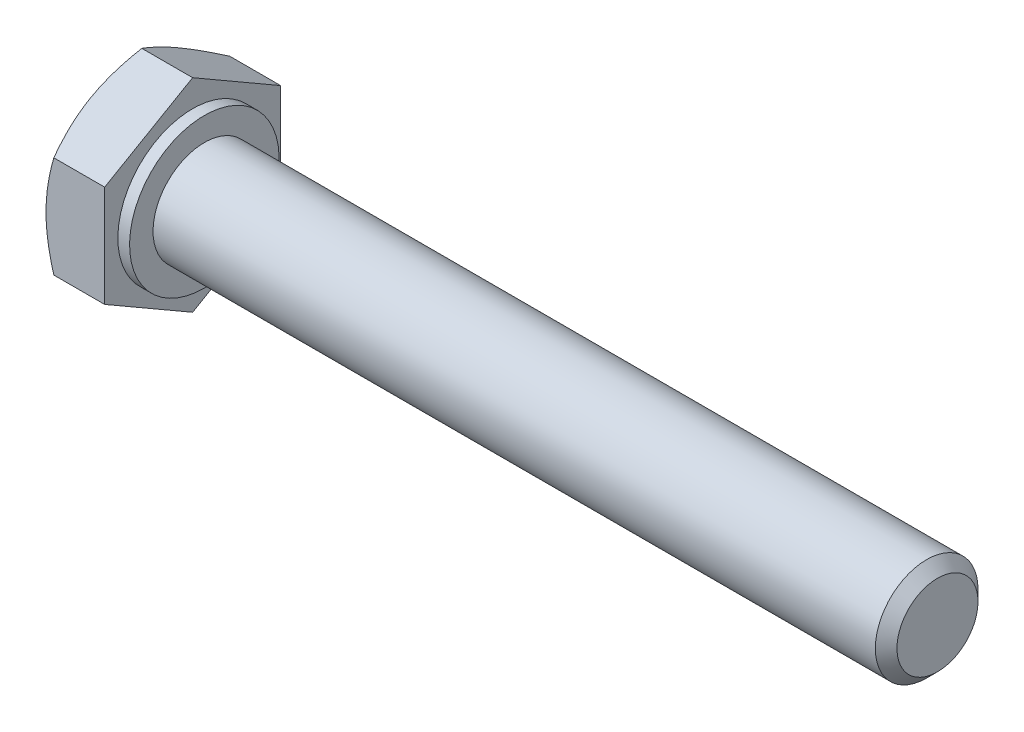
ISO-10303-21;
HEADER;
FILE_DESCRIPTION(('STEP AP214'),'2;1');
FILE_NAME('part.step','',(''),(''),'','','');
FILE_SCHEMA(('AUTOMOTIVE_DESIGN { 1 0 10303 214 1 1 1 1 }'));
ENDSEC;
DATA;
#1=APPLICATION_CONTEXT('core data for automotive mechanical design processes');
#2=APPLICATION_PROTOCOL_DEFINITION('international standard','automotive_design',2000,#1);
#3=PRODUCT_CONTEXT('',#1,'mechanical');
#4=PRODUCT('Part','Part','',(#3));
#5=PRODUCT_RELATED_PRODUCT_CATEGORY('part','',(#4));
#6=PRODUCT_DEFINITION_FORMATION('','',#4);
#7=PRODUCT_DEFINITION_CONTEXT('part definition',#1,'design');
#8=PRODUCT_DEFINITION('design','',#6,#7);
#9=PRODUCT_DEFINITION_SHAPE('','',#8);
#10=(LENGTH_UNIT() NAMED_UNIT(*) SI_UNIT(.MILLI.,.METRE.));
#11=(NAMED_UNIT(*) PLANE_ANGLE_UNIT() SI_UNIT($,.RADIAN.));
#12=(NAMED_UNIT(*) SI_UNIT($,.STERADIAN.) SOLID_ANGLE_UNIT());
#13=UNCERTAINTY_MEASURE_WITH_UNIT(LENGTH_MEASURE(1.E-05),#10,'distance_accuracy_value','');
#14=(GEOMETRIC_REPRESENTATION_CONTEXT(3) GLOBAL_UNCERTAINTY_ASSIGNED_CONTEXT((#13)) GLOBAL_UNIT_ASSIGNED_CONTEXT((#10,
#11,#12)) REPRESENTATION_CONTEXT('',''));
#15=CARTESIAN_POINT('',(0.,0.,0.));
#16=DIRECTION('',(0.,0.,1.));
#17=DIRECTION('',(1.,0.,0.));
#18=AXIS2_PLACEMENT_3D('',#15,#16,#17);
#19=CARTESIAN_POINT('',(0.,2.15,0.));
#20=DIRECTION('',(1.,0.,0.));
#21=DIRECTION('',(0.,1.,0.));
#22=AXIS2_PLACEMENT_3D('',#19,#20,#21);
#23=PLANE('',#22);
#24=CARTESIAN_POINT('',(0.,0.,0.));
#25=DIRECTION('',(1.,0.,0.));
#26=DIRECTION('',(0.,1.,0.));
#27=AXIS2_PLACEMENT_3D('',#24,#25,#26);
#28=CIRCLE('',#27,1.75);
#29=CARTESIAN_POINT('',(0.,-1.75,0.));
#30=VERTEX_POINT('',#29);
#31=EDGE_CURVE('E279',#30,#30,#28,.T.);
#32=ORIENTED_EDGE('',*,*,#31,.F.);
#33=EDGE_LOOP('',(#32));
#34=FACE_BOUND('',#33,.T.);
#35=CARTESIAN_POINT('',(0.,0.,0.));
#36=DIRECTION('',(1.,0.,0.));
#37=DIRECTION('',(0.,1.,0.));
#38=AXIS2_PLACEMENT_3D('',#35,#36,#37);
#39=CIRCLE('',#38,2.55);
#40=CARTESIAN_POINT('',(0.,-2.55,0.));
#41=VERTEX_POINT('',#40);
#42=EDGE_CURVE('E27',#41,#41,#39,.T.);
#43=ORIENTED_EDGE('',*,*,#42,.T.);
#44=EDGE_LOOP('',(#43));
#45=FACE_BOUND('',#44,.T.);
#46=ADVANCED_FACE('F16',(#34,#45),#23,.T.);
#47=CARTESIAN_POINT('',(-0.200049999999994,0.,0.));
#48=DIRECTION('',(1.,0.,0.));
#49=DIRECTION('',(0.,1.,0.));
#50=AXIS2_PLACEMENT_3D('',#47,#48,#49);
#51=CYLINDRICAL_SURFACE('',#50,2.55);
#52=ORIENTED_EDGE('',*,*,#42,.F.);
#53=DIRECTION('',(-1.,0.,0.));
#54=VECTOR('',#53,1.);
#55=CARTESIAN_POINT('',(-0.200049999999994,-2.55,0.));
#56=LINE('',#55,#54);
#57=CARTESIAN_POINT('',(-0.400099999999992,-2.55,0.));
#58=VERTEX_POINT('',#57);
#59=EDGE_CURVE('E11',#41,#58,#56,.T.);
#60=ORIENTED_EDGE('',*,*,#59,.T.);
#61=CARTESIAN_POINT('',(-0.400099999999992,0.,0.));
#62=DIRECTION('',(1.,0.,0.));
#63=DIRECTION('',(0.,1.,0.));
#64=AXIS2_PLACEMENT_3D('',#61,#62,#63);
#65=CIRCLE('',#64,2.55);
#66=EDGE_CURVE('E269',#58,#58,#65,.T.);
#67=ORIENTED_EDGE('',*,*,#66,.T.);
#68=ORIENTED_EDGE('',*,*,#59,.F.);
#69=EDGE_LOOP('',(#52,#60,#67,#68));
#70=FACE_BOUND('',#69,.T.);
#71=ADVANCED_FACE('F426',(#70),#51,.T.);
#72=CARTESIAN_POINT('',(-2.4001,0.,0.));
#73=DIRECTION('',(1.,0.,0.));
#74=DIRECTION('',(0.,1.,0.));
#75=AXIS2_PLACEMENT_3D('',#72,#73,#74);
#76=PLANE('',#75);
#77=CARTESIAN_POINT('',(-2.4001,0.,0.));
#78=DIRECTION('',(-1.,0.,0.));
#79=DIRECTION('',(0.,1.,0.));
#80=AXIS2_PLACEMENT_3D('',#77,#78,#79);
#81=CIRCLE('',#80,3.);
#82=CARTESIAN_POINT('',(-2.4001,0.,3.));
#83=VERTEX_POINT('',#82);
#84=CARTESIAN_POINT('',(-2.4001,2.59807621135331,1.5));
#85=VERTEX_POINT('',#84);
#86=EDGE_CURVE('E173',#83,#85,#81,.T.);
#87=ORIENTED_EDGE('',*,*,#86,.T.);
#88=CARTESIAN_POINT('',(-2.4001,0.,0.));
#89=DIRECTION('',(-1.,0.,0.));
#90=DIRECTION('',(0.,1.,0.));
#91=AXIS2_PLACEMENT_3D('',#88,#89,#90);
#92=CIRCLE('',#91,3.);
#93=CARTESIAN_POINT('',(-2.4001,2.59807621135331,-1.5));
#94=VERTEX_POINT('',#93);
#95=EDGE_CURVE('E180',#85,#94,#92,.T.);
#96=ORIENTED_EDGE('',*,*,#95,.T.);
#97=CARTESIAN_POINT('',(-2.4001,0.,0.));
#98=DIRECTION('',(-1.,0.,0.));
#99=DIRECTION('',(0.,1.,0.));
#100=AXIS2_PLACEMENT_3D('',#97,#98,#99);
#101=CIRCLE('',#100,3.);
#102=CARTESIAN_POINT('',(-2.4001,0.,-3.));
#103=VERTEX_POINT('',#102);
#104=EDGE_CURVE('E237',#94,#103,#101,.T.);
#105=ORIENTED_EDGE('',*,*,#104,.T.);
#106=CARTESIAN_POINT('',(-2.4001,0.,0.));
#107=DIRECTION('',(-1.,0.,0.));
#108=DIRECTION('',(0.,1.,0.));
#109=AXIS2_PLACEMENT_3D('',#106,#107,#108);
#110=CIRCLE('',#109,3.);
#111=CARTESIAN_POINT('',(-2.4001,-2.59807621135331,-1.5));
#112=VERTEX_POINT('',#111);
#113=EDGE_CURVE('E135',#103,#112,#110,.T.);
#114=ORIENTED_EDGE('',*,*,#113,.T.);
#115=CARTESIAN_POINT('',(-2.4001,0.,0.));
#116=DIRECTION('',(-1.,0.,0.));
#117=DIRECTION('',(0.,1.,0.));
#118=AXIS2_PLACEMENT_3D('',#115,#116,#117);
#119=CIRCLE('',#118,3.);
#120=CARTESIAN_POINT('',(-2.4001,-2.59807621135331,1.5));
#121=VERTEX_POINT('',#120);
#122=EDGE_CURVE('E127',#112,#121,#119,.T.);
#123=ORIENTED_EDGE('',*,*,#122,.T.);
#124=CARTESIAN_POINT('',(-2.4001,0.,0.));
#125=DIRECTION('',(-1.,0.,0.));
#126=DIRECTION('',(0.,1.,0.));
#127=AXIS2_PLACEMENT_3D('',#124,#125,#126);
#128=CIRCLE('',#127,3.);
#129=EDGE_CURVE('E132',#121,#83,#128,.T.);
#130=ORIENTED_EDGE('',*,*,#129,.T.);
#131=EDGE_LOOP('',(#87,#96,#105,#114,#123,#130));
#132=FACE_BOUND('',#131,.T.);
#133=ADVANCED_FACE('F130',(#132),#76,.F.);
#134=CARTESIAN_POINT('',(-0.400099999999993,-3.46410161513775,0.));
#135=DIRECTION('',(0.,-0.866025403784438,-0.5));
#136=DIRECTION('',(0.,0.5,-0.866025403784439));
#137=AXIS2_PLACEMENT_3D('',#134,#135,#136);
#138=PLANE('',#137);
#139=CARTESIAN_POINT('',(-2.4001,-2.59807621135331,-1.5));
#140=CARTESIAN_POINT('',(-2.40010000000001,-2.19615242270664,-2.19615242270662));
#141=CARTESIAN_POINT('',(-2.1321508075689,-1.73205080756889,-3.));
#142=(BOUNDED_CURVE() B_SPLINE_CURVE(2,(#139,#140,#141),.UNSPECIFIED.,.F.,
.F.) B_SPLINE_CURVE_WITH_KNOTS((3,3),(0.17571291563257,0.35142583126514),
.UNSPECIFIED.) CURVE() GEOMETRIC_REPRESENTATION_ITEM() RATIONAL_B_SPLINE_CURVE((1.,
1.03795484930203,1.)) REPRESENTATION_ITEM(''));
#143=CARTESIAN_POINT('',(-2.1321508075689,-1.73205080756889,-3.));
#144=VERTEX_POINT('',#143);
#145=EDGE_CURVE('E203',#112,#144,#142,.T.);
#146=ORIENTED_EDGE('',*,*,#145,.T.);
#147=DIRECTION('',(-1.,0.,0.));
#148=VECTOR('',#147,1.);
#149=CARTESIAN_POINT('',(-0.400099999999993,-1.73205080756887,-3.));
#150=LINE('',#149,#148);
#151=CARTESIAN_POINT('',(-0.400099999999993,-1.73205080756887,-3.));
#152=VERTEX_POINT('',#151);
#153=EDGE_CURVE('E263',#152,#144,#150,.T.);
#154=ORIENTED_EDGE('',*,*,#153,.F.);
#155=DIRECTION('',(0.,0.5,-0.866025403784438));
#156=VECTOR('',#155,1.);
#157=CARTESIAN_POINT('',(-0.400099999999993,-3.46410161513775,0.));
#158=LINE('',#157,#156);
#159=CARTESIAN_POINT('',(-0.400099999999993,-3.46410161513775,0.));
#160=VERTEX_POINT('',#159);
#161=EDGE_CURVE('E20',#160,#152,#158,.T.);
#162=ORIENTED_EDGE('',*,*,#161,.F.);
#163=DIRECTION('',(-1.,0.,0.));
#164=VECTOR('',#163,1.);
#165=CARTESIAN_POINT('',(-0.400099999999993,-3.46410161513775,0.));
#166=LINE('',#165,#164);
#167=CARTESIAN_POINT('',(-2.1321508075689,-3.46410161513774,0.));
#168=VERTEX_POINT('',#167);
#169=EDGE_CURVE('E268',#160,#168,#166,.T.);
#170=ORIENTED_EDGE('',*,*,#169,.T.);
#171=CARTESIAN_POINT('',(-2.1321508075689,-3.46410161513774,0.));
#172=CARTESIAN_POINT('',(-2.40010000000001,-2.99999999999999,-0.803847577293378));
#173=CARTESIAN_POINT('',(-2.4001,-2.59807621135331,-1.5));
#174=(BOUNDED_CURVE() B_SPLINE_CURVE(2,(#171,#172,#173),.UNSPECIFIED.,.F.,
.F.) B_SPLINE_CURVE_WITH_KNOTS((3,3),(0.,0.17571291563257),
.UNSPECIFIED.) CURVE() GEOMETRIC_REPRESENTATION_ITEM() RATIONAL_B_SPLINE_CURVE((1.,
1.03795484930203,1.)) REPRESENTATION_ITEM(''));
#175=EDGE_CURVE('E146',#168,#112,#174,.T.);
#176=ORIENTED_EDGE('',*,*,#175,.T.);
#177=EDGE_LOOP('',(#146,#154,#162,#170,#176));
#178=FACE_BOUND('',#177,.T.);
#179=ADVANCED_FACE('F345',(#178),#138,.T.);
#180=CARTESIAN_POINT('',(-0.400099999999993,-1.73205080756888,3.));
#181=DIRECTION('',(0.,-0.866025403784439,0.5));
#182=DIRECTION('',(-1.,0.,0.));
#183=AXIS2_PLACEMENT_3D('',#180,#181,#182);
#184=PLANE('',#183);
#185=CARTESIAN_POINT('',(-2.4001,-2.59807621135331,1.5));
#186=CARTESIAN_POINT('',(-2.40010000000001,-2.99999999999999,0.803847577293377));
#187=CARTESIAN_POINT('',(-2.1321508075689,-3.46410161513774,0.));
#188=(BOUNDED_CURVE() B_SPLINE_CURVE(2,(#185,#186,#187),.UNSPECIFIED.,.F.,
.F.) B_SPLINE_CURVE_WITH_KNOTS((3,3),(0.17571291563257,0.35142583126514),
.UNSPECIFIED.) CURVE() GEOMETRIC_REPRESENTATION_ITEM() RATIONAL_B_SPLINE_CURVE((1.,
1.03795484930203,1.)) REPRESENTATION_ITEM(''));
#189=EDGE_CURVE('E142',#121,#168,#188,.T.);
#190=ORIENTED_EDGE('',*,*,#189,.T.);
#191=ORIENTED_EDGE('',*,*,#169,.F.);
#192=DIRECTION('',(0.,-0.5,-0.866025403784439));
#193=VECTOR('',#192,1.);
#194=CARTESIAN_POINT('',(-0.400099999999993,-1.73205080756888,3.));
#195=LINE('',#194,#193);
#196=CARTESIAN_POINT('',(-0.400099999999993,-1.73205080756888,3.));
#197=VERTEX_POINT('',#196);
#198=EDGE_CURVE('E197',#197,#160,#195,.T.);
#199=ORIENTED_EDGE('',*,*,#198,.F.);
#200=DIRECTION('',(-1.,0.,0.));
#201=VECTOR('',#200,1.);
#202=CARTESIAN_POINT('',(-0.400099999999993,-1.73205080756888,3.));
#203=LINE('',#202,#201);
#204=CARTESIAN_POINT('',(-2.1321508075689,-1.73205080756885,3.));
#205=VERTEX_POINT('',#204);
#206=EDGE_CURVE('E163',#197,#205,#203,.T.);
#207=ORIENTED_EDGE('',*,*,#206,.T.);
#208=CARTESIAN_POINT('',(-2.1321508075689,-1.73205080756889,3.));
#209=CARTESIAN_POINT('',(-2.40010000000001,-2.19615242270664,2.19615242270662));
#210=CARTESIAN_POINT('',(-2.4001,-2.59807621135331,1.5));
#211=(BOUNDED_CURVE() B_SPLINE_CURVE(2,(#208,#209,#210),.UNSPECIFIED.,.F.,
.F.) B_SPLINE_CURVE_WITH_KNOTS((3,3),(0.,0.17571291563257),
.UNSPECIFIED.) CURVE() GEOMETRIC_REPRESENTATION_ITEM() RATIONAL_B_SPLINE_CURVE((1.,
1.03795484930203,1.)) REPRESENTATION_ITEM(''));
#212=EDGE_CURVE('E154',#205,#121,#211,.T.);
#213=ORIENTED_EDGE('',*,*,#212,.T.);
#214=EDGE_LOOP('',(#190,#191,#199,#207,#213));
#215=FACE_BOUND('',#214,.T.);
#216=ADVANCED_FACE('F161',(#215),#184,.T.);
#217=CARTESIAN_POINT('',(-0.400099999999994,1.73205080756887,3.));
#218=DIRECTION('',(0.,0.,1.));
#219=DIRECTION('',(0.,-1.,0.));
#220=AXIS2_PLACEMENT_3D('',#217,#218,#219);
#221=PLANE('',#220);
#222=CARTESIAN_POINT('',(-2.4001,0.,3.));
#223=CARTESIAN_POINT('',(-2.40010000000001,-0.803847577293359,3.));
#224=CARTESIAN_POINT('',(-2.1321508075689,-1.73205080756885,3.));
#225=(BOUNDED_CURVE() B_SPLINE_CURVE(2,(#222,#223,#224),.UNSPECIFIED.,.F.,
.F.) B_SPLINE_CURVE_WITH_KNOTS((3,3),(0.17571291563257,0.35142583126514),
.UNSPECIFIED.) CURVE() GEOMETRIC_REPRESENTATION_ITEM() RATIONAL_B_SPLINE_CURVE((1.,
1.03795484930204,1.)) REPRESENTATION_ITEM(''));
#226=EDGE_CURVE('E156',#83,#205,#225,.T.);
#227=ORIENTED_EDGE('',*,*,#226,.T.);
#228=ORIENTED_EDGE('',*,*,#206,.F.);
#229=DIRECTION('',(0.,-1.,0.));
#230=VECTOR('',#229,1.);
#231=CARTESIAN_POINT('',(-0.400099999999994,1.73205080756887,3.));
#232=LINE('',#231,#230);
#233=CARTESIAN_POINT('',(-0.400099999999994,1.73205080756887,3.));
#234=VERTEX_POINT('',#233);
#235=EDGE_CURVE('E200',#234,#197,#232,.T.);
#236=ORIENTED_EDGE('',*,*,#235,.F.);
#237=DIRECTION('',(-1.,0.,0.));
#238=VECTOR('',#237,1.);
#239=CARTESIAN_POINT('',(-0.400099999999994,1.73205080756887,3.));
#240=LINE('',#239,#238);
#241=CARTESIAN_POINT('',(-2.1321508075689,1.73205080756884,3.));
#242=VERTEX_POINT('',#241);
#243=EDGE_CURVE('E227',#234,#242,#240,.T.);
#244=ORIENTED_EDGE('',*,*,#243,.T.);
#245=CARTESIAN_POINT('',(-2.1321508075689,1.73205080756884,3.));
#246=CARTESIAN_POINT('',(-2.40010000000001,0.803847577293353,3.));
#247=CARTESIAN_POINT('',(-2.4001,0.,3.));
#248=(BOUNDED_CURVE() B_SPLINE_CURVE(2,(#245,#246,#247),.UNSPECIFIED.,.F.,
.F.) B_SPLINE_CURVE_WITH_KNOTS((3,3),(0.,0.17571291563257),
.UNSPECIFIED.) CURVE() GEOMETRIC_REPRESENTATION_ITEM() RATIONAL_B_SPLINE_CURVE((1.,
1.03795484930205,1.)) REPRESENTATION_ITEM(''));
#249=EDGE_CURVE('E165',#242,#83,#248,.T.);
#250=ORIENTED_EDGE('',*,*,#249,.T.);
#251=EDGE_LOOP('',(#227,#228,#236,#244,#250));
#252=FACE_BOUND('',#251,.T.);
#253=ADVANCED_FACE('F366',(#252),#221,.T.);
#254=CARTESIAN_POINT('',(-0.400099999999993,0.,0.));
#255=DIRECTION('',(1.,0.,0.));
#256=DIRECTION('',(0.,1.,0.));
#257=AXIS2_PLACEMENT_3D('',#254,#255,#256);
#258=PLANE('',#257);
#259=ORIENTED_EDGE('',*,*,#66,.F.);
#260=EDGE_LOOP('',(#259));
#261=FACE_BOUND('',#260,.T.);
#262=DIRECTION('',(0.,-0.5,0.866025403784438));
#263=VECTOR('',#262,1.);
#264=CARTESIAN_POINT('',(-0.400099999999994,3.46410161513775,0.));
#265=LINE('',#264,#263);
#266=CARTESIAN_POINT('',(-0.400099999999994,3.46410161513775,0.));
#267=VERTEX_POINT('',#266);
#268=EDGE_CURVE('E270',#267,#234,#265,.T.);
#269=ORIENTED_EDGE('',*,*,#268,.T.);
#270=ORIENTED_EDGE('',*,*,#235,.T.);
#271=ORIENTED_EDGE('',*,*,#198,.T.);
#272=ORIENTED_EDGE('',*,*,#161,.T.);
#273=DIRECTION('',(0.,1.,0.));
#274=VECTOR('',#273,1.);
#275=CARTESIAN_POINT('',(-0.400099999999993,-1.73205080756887,-3.));
#276=LINE('',#275,#274);
#277=CARTESIAN_POINT('',(-0.400099999999994,1.73205080756888,-3.));
#278=VERTEX_POINT('',#277);
#279=EDGE_CURVE('E207',#152,#278,#276,.T.);
#280=ORIENTED_EDGE('',*,*,#279,.T.);
#281=DIRECTION('',(0.,0.5,0.866025403784439));
#282=VECTOR('',#281,1.);
#283=CARTESIAN_POINT('',(-0.400099999999994,1.73205080756888,-3.));
#284=LINE('',#283,#282);
#285=EDGE_CURVE('E242',#278,#267,#284,.T.);
#286=ORIENTED_EDGE('',*,*,#285,.T.);
#287=EDGE_LOOP('',(#269,#270,#271,#272,#280,#286));
#288=FACE_BOUND('',#287,.T.);
#289=ADVANCED_FACE('F342',(#261,#288),#258,.T.);
#290=CARTESIAN_POINT('',(-0.400099999999994,3.46410161513775,0.));
#291=DIRECTION('',(0.,0.866025403784438,0.5));
#292=DIRECTION('',(1.,0.,0.));
#293=AXIS2_PLACEMENT_3D('',#290,#291,#292);
#294=PLANE('',#293);
#295=CARTESIAN_POINT('',(-2.1321508075689,3.46410161513774,0.));
#296=CARTESIAN_POINT('',(-2.40010000000001,2.99999999999999,0.803847577293379));
#297=CARTESIAN_POINT('',(-2.4001,2.59807621135331,1.5));
#298=(BOUNDED_CURVE() B_SPLINE_CURVE(2,(#295,#296,#297),.UNSPECIFIED.,.F.,
.F.) B_SPLINE_CURVE_WITH_KNOTS((3,3),(0.,0.17571291563257),
.UNSPECIFIED.) CURVE() GEOMETRIC_REPRESENTATION_ITEM() RATIONAL_B_SPLINE_CURVE((1.,
1.03795484930203,1.)) REPRESENTATION_ITEM(''));
#299=CARTESIAN_POINT('',(-2.1321508075689,3.46410161513774,0.));
#300=VERTEX_POINT('',#299);
#301=EDGE_CURVE('E186',#300,#85,#298,.T.);
#302=ORIENTED_EDGE('',*,*,#301,.T.);
#303=CARTESIAN_POINT('',(-2.4001,2.59807621135331,1.5));
#304=CARTESIAN_POINT('',(-2.40010000000001,2.19615242270663,2.19615242270662));
#305=CARTESIAN_POINT('',(-2.1321508075689,1.73205080756889,3.));
#306=(BOUNDED_CURVE() B_SPLINE_CURVE(2,(#303,#304,#305),.UNSPECIFIED.,.F.,
.F.) B_SPLINE_CURVE_WITH_KNOTS((3,3),(0.17571291563257,0.35142583126514),
.UNSPECIFIED.) CURVE() GEOMETRIC_REPRESENTATION_ITEM() RATIONAL_B_SPLINE_CURVE((1.,
1.03795484930204,1.)) REPRESENTATION_ITEM(''));
#307=EDGE_CURVE('E274',#85,#242,#306,.T.);
#308=ORIENTED_EDGE('',*,*,#307,.T.);
#309=ORIENTED_EDGE('',*,*,#243,.F.);
#310=ORIENTED_EDGE('',*,*,#268,.F.);
#311=DIRECTION('',(-1.,0.,0.));
#312=VECTOR('',#311,1.);
#313=CARTESIAN_POINT('',(-0.400099999999994,3.46410161513775,0.));
#314=LINE('',#313,#312);
#315=EDGE_CURVE('E246',#267,#300,#314,.T.);
#316=ORIENTED_EDGE('',*,*,#315,.T.);
#317=EDGE_LOOP('',(#302,#308,#309,#310,#316));
#318=FACE_BOUND('',#317,.T.);
#319=ADVANCED_FACE('F363',(#318),#294,.T.);
#320=CARTESIAN_POINT('',(-0.400099999999994,1.73205080756888,-3.));
#321=DIRECTION('',(0.,0.866025403784439,-0.5));
#322=DIRECTION('',(-1.,0.,0.));
#323=AXIS2_PLACEMENT_3D('',#320,#321,#322);
#324=PLANE('',#323);
#325=CARTESIAN_POINT('',(-2.1321508075689,1.73205080756889,-3.));
#326=CARTESIAN_POINT('',(-2.40010000000001,2.19615242270664,-2.19615242270662));
#327=CARTESIAN_POINT('',(-2.4001,2.59807621135331,-1.5));
#328=(BOUNDED_CURVE() B_SPLINE_CURVE(2,(#325,#326,#327),.UNSPECIFIED.,.F.,
.F.) B_SPLINE_CURVE_WITH_KNOTS((3,3),(0.,0.17571291563257),
.UNSPECIFIED.) CURVE() GEOMETRIC_REPRESENTATION_ITEM() RATIONAL_B_SPLINE_CURVE((1.,
1.03795484930204,1.)) REPRESENTATION_ITEM(''));
#329=CARTESIAN_POINT('',(-2.1321508075689,1.73205080756885,-3.));
#330=VERTEX_POINT('',#329);
#331=EDGE_CURVE('E221',#330,#94,#328,.T.);
#332=ORIENTED_EDGE('',*,*,#331,.T.);
#333=CARTESIAN_POINT('',(-2.4001,2.59807621135331,-1.5));
#334=CARTESIAN_POINT('',(-2.40010000000001,2.99999999999999,-0.803847577293378));
#335=CARTESIAN_POINT('',(-2.1321508075689,3.46410161513774,0.));
#336=(BOUNDED_CURVE() B_SPLINE_CURVE(2,(#333,#334,#335),.UNSPECIFIED.,.F.,
.F.) B_SPLINE_CURVE_WITH_KNOTS((3,3),(0.17571291563257,0.35142583126514),
.UNSPECIFIED.) CURVE() GEOMETRIC_REPRESENTATION_ITEM() RATIONAL_B_SPLINE_CURVE((1.,
1.03795484930204,1.)) REPRESENTATION_ITEM(''));
#337=EDGE_CURVE('E159',#94,#300,#336,.T.);
#338=ORIENTED_EDGE('',*,*,#337,.T.);
#339=ORIENTED_EDGE('',*,*,#315,.F.);
#340=ORIENTED_EDGE('',*,*,#285,.F.);
#341=DIRECTION('',(-1.,0.,0.));
#342=VECTOR('',#341,1.);
#343=CARTESIAN_POINT('',(-0.400099999999994,1.73205080756888,-3.));
#344=LINE('',#343,#342);
#345=EDGE_CURVE('E202',#278,#330,#344,.T.);
#346=ORIENTED_EDGE('',*,*,#345,.T.);
#347=EDGE_LOOP('',(#332,#338,#339,#340,#346));
#348=FACE_BOUND('',#347,.T.);
#349=ADVANCED_FACE('F18',(#348),#324,.T.);
#350=CARTESIAN_POINT('',(-0.400099999999993,-1.73205080756887,-3.));
#351=DIRECTION('',(0.,0.,-1.));
#352=DIRECTION('',(-1.,0.,0.));
#353=AXIS2_PLACEMENT_3D('',#350,#351,#352);
#354=PLANE('',#353);
#355=CARTESIAN_POINT('',(-2.1321508075689,-1.73205080756885,-3.));
#356=CARTESIAN_POINT('',(-2.40010000000001,-0.803847577293356,-3.));
#357=CARTESIAN_POINT('',(-2.4001,0.,-3.));
#358=(BOUNDED_CURVE() B_SPLINE_CURVE(2,(#355,#356,#357),.UNSPECIFIED.,.F.,
.F.) B_SPLINE_CURVE_WITH_KNOTS((3,3),(0.,0.17571291563257),
.UNSPECIFIED.) CURVE() GEOMETRIC_REPRESENTATION_ITEM() RATIONAL_B_SPLINE_CURVE((1.,
1.03795484930204,1.)) REPRESENTATION_ITEM(''));
#359=EDGE_CURVE('E211',#144,#103,#358,.T.);
#360=ORIENTED_EDGE('',*,*,#359,.T.);
#361=CARTESIAN_POINT('',(-2.4001,0.,-3.));
#362=CARTESIAN_POINT('',(-2.40010000000001,0.803847577293357,-3.));
#363=CARTESIAN_POINT('',(-2.1321508075689,1.73205080756885,-3.));
#364=(BOUNDED_CURVE() B_SPLINE_CURVE(2,(#361,#362,#363),.UNSPECIFIED.,.F.,
.F.) B_SPLINE_CURVE_WITH_KNOTS((3,3),(0.17571291563257,0.35142583126514),
.UNSPECIFIED.) CURVE() GEOMETRIC_REPRESENTATION_ITEM() RATIONAL_B_SPLINE_CURVE((1.,
1.03795484930205,1.)) REPRESENTATION_ITEM(''));
#365=EDGE_CURVE('E141',#103,#330,#364,.T.);
#366=ORIENTED_EDGE('',*,*,#365,.T.);
#367=ORIENTED_EDGE('',*,*,#345,.F.);
#368=ORIENTED_EDGE('',*,*,#279,.F.);
#369=ORIENTED_EDGE('',*,*,#153,.T.);
#370=EDGE_LOOP('',(#360,#366,#367,#368,#369));
#371=FACE_BOUND('',#370,.T.);
#372=ADVANCED_FACE('F347',(#371),#354,.T.);
#373=CARTESIAN_POINT('',(-2.26612540378445,0.,0.));
#374=DIRECTION('',(1.,0.,0.));
#375=DIRECTION('',(0.,1.,0.));
#376=AXIS2_PLACEMENT_3D('',#373,#374,#375);
#377=CONICAL_SURFACE('',#376,3.23205080756887,1.0471975511966);
#378=ORIENTED_EDGE('',*,*,#359,.F.);
#379=ORIENTED_EDGE('',*,*,#145,.F.);
#380=ORIENTED_EDGE('',*,*,#113,.F.);
#381=EDGE_LOOP('',(#378,#379,#380));
#382=FACE_BOUND('',#381,.T.);
#383=ADVANCED_FACE('F431',(#382),#377,.T.);
#384=CARTESIAN_POINT('',(-2.26612540378445,0.,0.));
#385=DIRECTION('',(1.,0.,0.));
#386=DIRECTION('',(0.,1.,0.));
#387=AXIS2_PLACEMENT_3D('',#384,#385,#386);
#388=CONICAL_SURFACE('',#387,3.23205080756887,1.0471975511966);
#389=ORIENTED_EDGE('',*,*,#365,.F.);
#390=ORIENTED_EDGE('',*,*,#104,.F.);
#391=ORIENTED_EDGE('',*,*,#331,.F.);
#392=EDGE_LOOP('',(#389,#390,#391));
#393=FACE_BOUND('',#392,.T.);
#394=ADVANCED_FACE('F354',(#393),#388,.T.);
#395=CARTESIAN_POINT('',(-2.26612540378445,0.,0.));
#396=DIRECTION('',(1.,0.,0.));
#397=DIRECTION('',(0.,-1.,0.));
#398=AXIS2_PLACEMENT_3D('',#395,#396,#397);
#399=CONICAL_SURFACE('',#398,3.23205080756887,1.0471975511966);
#400=ORIENTED_EDGE('',*,*,#175,.F.);
#401=ORIENTED_EDGE('',*,*,#189,.F.);
#402=ORIENTED_EDGE('',*,*,#122,.F.);
#403=EDGE_LOOP('',(#400,#401,#402));
#404=FACE_BOUND('',#403,.T.);
#405=ADVANCED_FACE('F145',(#404),#399,.T.);
#406=CARTESIAN_POINT('',(-2.26612540378445,0.,0.));
#407=DIRECTION('',(1.,0.,0.));
#408=DIRECTION('',(0.,1.,0.));
#409=AXIS2_PLACEMENT_3D('',#406,#407,#408);
#410=CONICAL_SURFACE('',#409,3.23205080756887,1.0471975511966);
#411=ORIENTED_EDGE('',*,*,#337,.F.);
#412=ORIENTED_EDGE('',*,*,#95,.F.);
#413=ORIENTED_EDGE('',*,*,#301,.F.);
#414=EDGE_LOOP('',(#411,#412,#413));
#415=FACE_BOUND('',#414,.T.);
#416=ADVANCED_FACE('F361',(#415),#410,.T.);
#417=CARTESIAN_POINT('',(-2.26612540378445,0.,0.));
#418=DIRECTION('',(1.,0.,0.));
#419=DIRECTION('',(0.,1.,0.));
#420=AXIS2_PLACEMENT_3D('',#417,#418,#419);
#421=CONICAL_SURFACE('',#420,3.23205080756887,1.0471975511966);
#422=ORIENTED_EDGE('',*,*,#212,.F.);
#423=ORIENTED_EDGE('',*,*,#226,.F.);
#424=ORIENTED_EDGE('',*,*,#129,.F.);
#425=EDGE_LOOP('',(#422,#423,#424));
#426=FACE_BOUND('',#425,.T.);
#427=ADVANCED_FACE('F153',(#426),#421,.T.);
#428=CARTESIAN_POINT('',(-2.26612540378445,0.,0.));
#429=DIRECTION('',(1.,0.,0.));
#430=DIRECTION('',(0.,1.,0.));
#431=AXIS2_PLACEMENT_3D('',#428,#429,#430);
#432=CONICAL_SURFACE('',#431,3.23205080756887,1.0471975511966);
#433=ORIENTED_EDGE('',*,*,#307,.F.);
#434=ORIENTED_EDGE('',*,*,#86,.F.);
#435=ORIENTED_EDGE('',*,*,#249,.F.);
#436=EDGE_LOOP('',(#433,#434,#435));
#437=FACE_BOUND('',#436,.T.);
#438=ADVANCED_FACE('F412',(#437),#432,.T.);
#439=CARTESIAN_POINT('',(25.,0.875,0.));
#440=DIRECTION('',(1.,0.,0.));
#441=DIRECTION('',(0.,1.,0.));
#442=AXIS2_PLACEMENT_3D('',#439,#440,#441);
#443=PLANE('',#442);
#444=CARTESIAN_POINT('',(25.,0.,0.));
#445=DIRECTION('',(-1.,0.,0.));
#446=DIRECTION('',(0.,-1.,0.));
#447=AXIS2_PLACEMENT_3D('',#444,#445,#446);
#448=CIRCLE('',#447,1.38193);
#449=CARTESIAN_POINT('',(25.,1.38193,0.));
#450=VERTEX_POINT('',#449);
#451=EDGE_CURVE('E192',#450,#450,#448,.T.);
#452=ORIENTED_EDGE('',*,*,#451,.F.);
#453=EDGE_LOOP('',(#452));
#454=FACE_BOUND('',#453,.T.);
#455=ADVANCED_FACE('F490',(#454),#443,.T.);
#456=CARTESIAN_POINT('',(18.5,0.,0.));
#457=DIRECTION('',(1.,0.,0.));
#458=DIRECTION('',(0.,1.,0.));
#459=AXIS2_PLACEMENT_3D('',#456,#457,#458);
#460=CYLINDRICAL_SURFACE('',#459,1.75);
#461=CARTESIAN_POINT('',(24.63183,0.,0.));
#462=DIRECTION('',(1.,0.,0.));
#463=DIRECTION('',(0.,-1.,0.));
#464=AXIS2_PLACEMENT_3D('',#461,#462,#463);
#465=CIRCLE('',#464,1.75);
#466=CARTESIAN_POINT('',(24.63183,1.75,0.));
#467=VERTEX_POINT('',#466);
#468=CARTESIAN_POINT('',(24.63183,-1.75,0.));
#469=VERTEX_POINT('',#468);
#470=EDGE_CURVE('E191',#467,#469,#465,.T.);
#471=ORIENTED_EDGE('',*,*,#470,.F.);
#472=CARTESIAN_POINT('',(24.63183,0.,0.));
#473=DIRECTION('',(1.,0.,0.));
#474=DIRECTION('',(0.,-1.,0.));
#475=AXIS2_PLACEMENT_3D('',#472,#473,#474);
#476=CIRCLE('',#475,1.75);
#477=EDGE_CURVE('E193',#469,#467,#476,.T.);
#478=ORIENTED_EDGE('',*,*,#477,.F.);
#479=DIRECTION('',(-1.,0.,0.));
#480=VECTOR('',#479,1.);
#481=CARTESIAN_POINT('',(18.5,-1.75,0.));
#482=LINE('',#481,#480);
#483=EDGE_CURVE('E196',#469,#30,#482,.T.);
#484=ORIENTED_EDGE('',*,*,#483,.T.);
#485=ORIENTED_EDGE('',*,*,#31,.T.);
#486=ORIENTED_EDGE('',*,*,#483,.F.);
#487=EDGE_LOOP('',(#471,#478,#484,#485,#486));
#488=FACE_BOUND('',#487,.T.);
#489=ADVANCED_FACE('F494',(#488),#460,.T.);
#490=CARTESIAN_POINT('',(24.815915,0.,0.));
#491=DIRECTION('',(-1.,0.,0.));
#492=DIRECTION('',(0.,-1.,0.));
#493=AXIS2_PLACEMENT_3D('',#490,#491,#492);
#494=CONICAL_SURFACE('',#493,1.565965,0.785262338123914);
#495=ORIENTED_EDGE('',*,*,#451,.T.);
#496=DIRECTION('',(-0.707202817635693,0.707010731692339,0.));
#497=VECTOR('',#496,1.);
#498=CARTESIAN_POINT('',(24.815915,1.565965,0.));
#499=LINE('',#498,#497);
#500=EDGE_CURVE('E187',#450,#467,#499,.T.);
#501=ORIENTED_EDGE('',*,*,#500,.T.);
#502=ORIENTED_EDGE('',*,*,#470,.T.);
#503=ORIENTED_EDGE('',*,*,#477,.T.);
#504=ORIENTED_EDGE('',*,*,#500,.F.);
#505=EDGE_LOOP('',(#495,#501,#502,#503,#504));
#506=FACE_BOUND('',#505,.T.);
#507=ADVANCED_FACE('F507',(#506),#494,.T.);
#508=CLOSED_SHELL('',(#46,#71,#133,#179,#216,#253,#289,#319,#349,#372,#383,#394,#405,#416,#427,
#438,#455,#489,#507));
#509=MANIFOLD_SOLID_BREP('B1',#508);
#510=ADVANCED_BREP_SHAPE_REPRESENTATION('',(#18,#509),#14);
#511=SHAPE_DEFINITION_REPRESENTATION(#9,#510);
ENDSEC;
END-ISO-10303-21;
